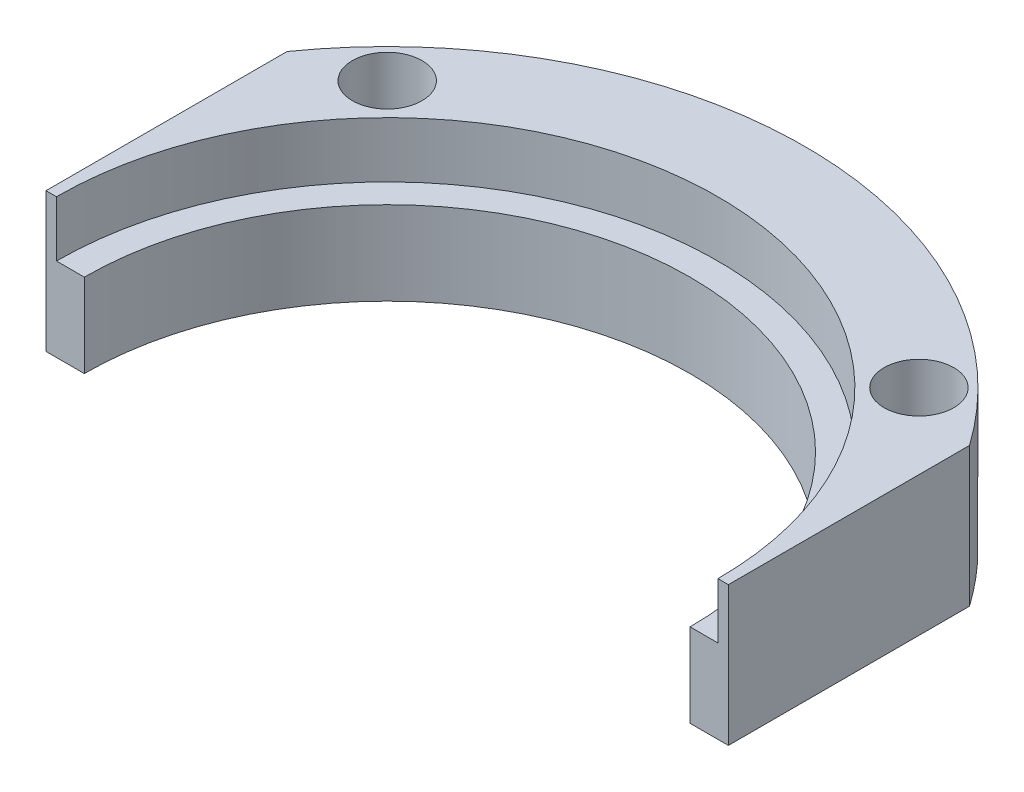
ISO-10303-21;
HEADER;
FILE_DESCRIPTION(('STEP AP214'),'2;1');
FILE_NAME('part.step','',(''),(''),'','','');
FILE_SCHEMA(('AUTOMOTIVE_DESIGN { 1 0 10303 214 1 1 1 1 }'));
ENDSEC;
DATA;
#1=APPLICATION_CONTEXT('core data for automotive mechanical design processes');
#2=APPLICATION_PROTOCOL_DEFINITION('international standard','automotive_design',2000,#1);
#3=PRODUCT_CONTEXT('',#1,'mechanical');
#4=PRODUCT('Part','Part','',(#3));
#5=PRODUCT_RELATED_PRODUCT_CATEGORY('part','',(#4));
#6=PRODUCT_DEFINITION_FORMATION('','',#4);
#7=PRODUCT_DEFINITION_CONTEXT('part definition',#1,'design');
#8=PRODUCT_DEFINITION('design','',#6,#7);
#9=PRODUCT_DEFINITION_SHAPE('','',#8);
#10=(LENGTH_UNIT() NAMED_UNIT(*) SI_UNIT(.MILLI.,.METRE.));
#11=(NAMED_UNIT(*) PLANE_ANGLE_UNIT() SI_UNIT($,.RADIAN.));
#12=(NAMED_UNIT(*) SI_UNIT($,.STERADIAN.) SOLID_ANGLE_UNIT());
#13=UNCERTAINTY_MEASURE_WITH_UNIT(LENGTH_MEASURE(1.E-05),#10,'distance_accuracy_value','');
#14=(GEOMETRIC_REPRESENTATION_CONTEXT(3) GLOBAL_UNCERTAINTY_ASSIGNED_CONTEXT((#13)) GLOBAL_UNIT_ASSIGNED_CONTEXT((#10,
#11,#12)) REPRESENTATION_CONTEXT('',''));
#15=CARTESIAN_POINT('',(0.,0.,0.));
#16=DIRECTION('',(0.,0.,1.));
#17=DIRECTION('',(1.,0.,0.));
#18=AXIS2_PLACEMENT_3D('',#15,#16,#17);
#19=CARTESIAN_POINT('',(0.,20.,0.));
#20=DIRECTION('',(0.,-1.,0.));
#21=DIRECTION('',(0.,0.,-1.));
#22=AXIS2_PLACEMENT_3D('',#19,#20,#21);
#23=CYLINDRICAL_SURFACE('',#22,43.5);
#24=CARTESIAN_POINT('',(0.,12.,0.));
#25=DIRECTION('',(0.,1.,0.));
#26=DIRECTION('',(0.,0.,1.));
#27=AXIS2_PLACEMENT_3D('',#24,#25,#26);
#28=CIRCLE('',#27,43.5);
#29=CARTESIAN_POINT('',(-43.5,12.,0.));
#30=VERTEX_POINT('',#29);
#31=CARTESIAN_POINT('',(43.5,12.,0.));
#32=VERTEX_POINT('',#31);
#33=EDGE_CURVE('E11',#30,#32,#28,.F.);
#34=ORIENTED_EDGE('',*,*,#33,.F.);
#35=DIRECTION('',(0.,-1.,0.));
#36=VECTOR('',#35,1.);
#37=CARTESIAN_POINT('',(-43.5,20.,0.));
#38=LINE('',#37,#36);
#39=CARTESIAN_POINT('',(-43.5,0.,0.));
#40=VERTEX_POINT('',#39);
#41=EDGE_CURVE('E169',#40,#30,#38,.F.);
#42=ORIENTED_EDGE('',*,*,#41,.F.);
#43=CARTESIAN_POINT('',(0.,0.,0.));
#44=DIRECTION('',(0.,1.,0.));
#45=DIRECTION('',(0.,0.,1.));
#46=AXIS2_PLACEMENT_3D('',#43,#44,#45);
#47=CIRCLE('',#46,43.5);
#48=CARTESIAN_POINT('',(43.5,0.,0.));
#49=VERTEX_POINT('',#48);
#50=EDGE_CURVE('E42',#49,#40,#47,.T.);
#51=ORIENTED_EDGE('',*,*,#50,.F.);
#52=DIRECTION('',(0.,-1.,0.));
#53=VECTOR('',#52,1.);
#54=CARTESIAN_POINT('',(43.5,20.,0.));
#55=LINE('',#54,#53);
#56=EDGE_CURVE('E172',#32,#49,#55,.T.);
#57=ORIENTED_EDGE('',*,*,#56,.F.);
#58=EDGE_LOOP('',(#34,#42,#51,#57));
#59=FACE_BOUND('',#58,.T.);
#60=ADVANCED_FACE('F33',(#59),#23,.F.);
#61=CARTESIAN_POINT('',(0.,20.,0.));
#62=DIRECTION('',(0.,0.,-1.));
#63=DIRECTION('',(-1.,0.,0.));
#64=AXIS2_PLACEMENT_3D('',#61,#62,#63);
#65=PLANE('',#64);
#66=DIRECTION('',(1.,0.,0.));
#67=VECTOR('',#66,1.);
#68=CARTESIAN_POINT('',(0.,20.,0.));
#69=LINE('',#68,#67);
#70=CARTESIAN_POINT('',(47.5,20.,0.));
#71=VERTEX_POINT('',#70);
#72=CARTESIAN_POINT('',(49.,20.,0.));
#73=VERTEX_POINT('',#72);
#74=EDGE_CURVE('E184',#71,#73,#69,.T.);
#75=ORIENTED_EDGE('',*,*,#74,.F.);
#76=DIRECTION('',(0.,1.,0.));
#77=VECTOR('',#76,1.);
#78=CARTESIAN_POINT('',(47.5,12.,0.));
#79=LINE('',#78,#77);
#80=CARTESIAN_POINT('',(47.5,12.,0.));
#81=VERTEX_POINT('',#80);
#82=EDGE_CURVE('E166',#71,#81,#79,.F.);
#83=ORIENTED_EDGE('',*,*,#82,.T.);
#84=DIRECTION('',(1.,0.,0.));
#85=VECTOR('',#84,1.);
#86=CARTESIAN_POINT('',(0.,12.,0.));
#87=LINE('',#86,#85);
#88=EDGE_CURVE('E161',#32,#81,#87,.T.);
#89=ORIENTED_EDGE('',*,*,#88,.F.);
#90=ORIENTED_EDGE('',*,*,#56,.T.);
#91=DIRECTION('',(1.,0.,0.));
#92=VECTOR('',#91,1.);
#93=CARTESIAN_POINT('',(0.,0.,0.));
#94=LINE('',#93,#92);
#95=CARTESIAN_POINT('',(49.,0.,0.));
#96=VERTEX_POINT('',#95);
#97=EDGE_CURVE('E198',#49,#96,#94,.T.);
#98=ORIENTED_EDGE('',*,*,#97,.T.);
#99=DIRECTION('',(0.,-1.,0.));
#100=VECTOR('',#99,1.);
#101=CARTESIAN_POINT('',(49.,20.,0.));
#102=LINE('',#101,#100);
#103=EDGE_CURVE('E188',#73,#96,#102,.T.);
#104=ORIENTED_EDGE('',*,*,#103,.F.);
#105=EDGE_LOOP('',(#75,#83,#89,#90,#98,#104));
#106=FACE_BOUND('',#105,.T.);
#107=ADVANCED_FACE('F262',(#106),#65,.F.);
#108=CARTESIAN_POINT('',(49.,20.,0.));
#109=DIRECTION('',(-1.,0.,0.));
#110=DIRECTION('',(0.,0.,1.));
#111=AXIS2_PLACEMENT_3D('',#108,#109,#110);
#112=PLANE('',#111);
#113=DIRECTION('',(0.,0.,-1.));
#114=VECTOR('',#113,1.);
#115=CARTESIAN_POINT('',(49.,0.,0.));
#116=LINE('',#115,#114);
#117=CARTESIAN_POINT('',(49.,0.,-34.6265793863616));
#118=VERTEX_POINT('',#117);
#119=EDGE_CURVE('E174',#96,#118,#116,.T.);
#120=ORIENTED_EDGE('',*,*,#119,.T.);
#121=DIRECTION('',(0.,-1.,0.));
#122=VECTOR('',#121,1.);
#123=CARTESIAN_POINT('',(49.,20.,-34.6265793863616));
#124=LINE('',#123,#122);
#125=CARTESIAN_POINT('',(49.,20.,-34.6265793863616));
#126=VERTEX_POINT('',#125);
#127=EDGE_CURVE('E208',#126,#118,#124,.T.);
#128=ORIENTED_EDGE('',*,*,#127,.F.);
#129=DIRECTION('',(0.,0.,-1.));
#130=VECTOR('',#129,1.);
#131=CARTESIAN_POINT('',(49.,20.,0.));
#132=LINE('',#131,#130);
#133=EDGE_CURVE('E175',#73,#126,#132,.T.);
#134=ORIENTED_EDGE('',*,*,#133,.F.);
#135=ORIENTED_EDGE('',*,*,#103,.T.);
#136=EDGE_LOOP('',(#120,#128,#134,#135));
#137=FACE_BOUND('',#136,.T.);
#138=ADVANCED_FACE('F35',(#137),#112,.F.);
#139=CARTESIAN_POINT('',(0.,20.,0.));
#140=DIRECTION('',(0.,-1.,0.));
#141=DIRECTION('',(0.,0.,-1.));
#142=AXIS2_PLACEMENT_3D('',#139,#140,#141);
#143=CYLINDRICAL_SURFACE('',#142,60.);
#144=CARTESIAN_POINT('',(0.,0.,0.));
#145=DIRECTION('',(0.,1.,0.));
#146=DIRECTION('',(0.,0.,1.));
#147=AXIS2_PLACEMENT_3D('',#144,#145,#146);
#148=CIRCLE('',#147,60.);
#149=CARTESIAN_POINT('',(40.5225457255929,0.,-44.2484269541554));
#150=VERTEX_POINT('',#149);
#151=CARTESIAN_POINT('',(-40.5225457255929,0.,-44.2484269541554));
#152=VERTEX_POINT('',#151);
#153=EDGE_CURVE('E139',#150,#152,#148,.T.);
#154=ORIENTED_EDGE('',*,*,#153,.T.);
#155=DIRECTION('',(0.,-1.,0.));
#156=VECTOR('',#155,1.);
#157=CARTESIAN_POINT('',(-40.5225457255929,10.,-44.2484269541554));
#158=LINE('',#157,#156);
#159=CARTESIAN_POINT('',(-40.5225457255929,10.,-44.2484269541554));
#160=VERTEX_POINT('',#159);
#161=EDGE_CURVE('E50',#160,#152,#158,.T.);
#162=ORIENTED_EDGE('',*,*,#161,.F.);
#163=CARTESIAN_POINT('',(0.,10.,0.));
#164=DIRECTION('',(0.,-1.,0.));
#165=DIRECTION('',(0.,0.,-1.));
#166=AXIS2_PLACEMENT_3D('',#163,#164,#165);
#167=CIRCLE('',#166,60.);
#168=CARTESIAN_POINT('',(-44.2484269541554,10.,-40.5225457255929));
#169=VERTEX_POINT('',#168);
#170=EDGE_CURVE('E125',#169,#160,#167,.T.);
#171=ORIENTED_EDGE('',*,*,#170,.F.);
#172=DIRECTION('',(0.,-1.,0.));
#173=VECTOR('',#172,1.);
#174=CARTESIAN_POINT('',(-44.2484269541554,10.,-40.5225457255929));
#175=LINE('',#174,#173);
#176=CARTESIAN_POINT('',(-44.2484269541554,0.,-40.5225457255929));
#177=VERTEX_POINT('',#176);
#178=EDGE_CURVE('E133',#169,#177,#175,.T.);
#179=ORIENTED_EDGE('',*,*,#178,.T.);
#180=CARTESIAN_POINT('',(-49.,0.,-34.6265793863616));
#181=VERTEX_POINT('',#180);
#182=EDGE_CURVE('E191',#177,#181,#148,.T.);
#183=ORIENTED_EDGE('',*,*,#182,.T.);
#184=DIRECTION('',(0.,-1.,0.));
#185=VECTOR('',#184,1.);
#186=CARTESIAN_POINT('',(-49.,20.,-34.6265793863616));
#187=LINE('',#186,#185);
#188=CARTESIAN_POINT('',(-49.,20.,-34.6265793863616));
#189=VERTEX_POINT('',#188);
#190=EDGE_CURVE('E205',#189,#181,#187,.T.);
#191=ORIENTED_EDGE('',*,*,#190,.F.);
#192=CARTESIAN_POINT('',(0.,20.,0.));
#193=DIRECTION('',(0.,1.,0.));
#194=DIRECTION('',(0.,0.,1.));
#195=AXIS2_PLACEMENT_3D('',#192,#193,#194);
#196=CIRCLE('',#195,60.);
#197=EDGE_CURVE('E178',#126,#189,#196,.T.);
#198=ORIENTED_EDGE('',*,*,#197,.F.);
#199=ORIENTED_EDGE('',*,*,#127,.T.);
#200=CARTESIAN_POINT('',(44.2484269541554,0.,-40.5225457255929));
#201=VERTEX_POINT('',#200);
#202=EDGE_CURVE('E192',#118,#201,#148,.T.);
#203=ORIENTED_EDGE('',*,*,#202,.T.);
#204=DIRECTION('',(0.,-1.,0.));
#205=VECTOR('',#204,1.);
#206=CARTESIAN_POINT('',(44.2484269541554,10.,-40.5225457255929));
#207=LINE('',#206,#205);
#208=CARTESIAN_POINT('',(44.2484269541554,10.,-40.5225457255929));
#209=VERTEX_POINT('',#208);
#210=EDGE_CURVE('E58',#209,#201,#207,.T.);
#211=ORIENTED_EDGE('',*,*,#210,.F.);
#212=CARTESIAN_POINT('',(0.,10.,0.));
#213=DIRECTION('',(0.,-1.,0.));
#214=DIRECTION('',(0.,0.,-1.));
#215=AXIS2_PLACEMENT_3D('',#212,#213,#214);
#216=CIRCLE('',#215,60.);
#217=CARTESIAN_POINT('',(40.5225457255929,10.,-44.2484269541554));
#218=VERTEX_POINT('',#217);
#219=EDGE_CURVE('E145',#218,#209,#216,.T.);
#220=ORIENTED_EDGE('',*,*,#219,.F.);
#221=DIRECTION('',(0.,-1.,0.));
#222=VECTOR('',#221,1.);
#223=CARTESIAN_POINT('',(40.5225457255929,10.,-44.2484269541554));
#224=LINE('',#223,#222);
#225=EDGE_CURVE('E151',#218,#150,#224,.T.);
#226=ORIENTED_EDGE('',*,*,#225,.T.);
#227=EDGE_LOOP('',(#154,#162,#171,#179,#183,#191,#198,#199,#203,#211,#220,#226));
#228=FACE_BOUND('',#227,.T.);
#229=ADVANCED_FACE('F136',(#228),#143,.T.);
#230=CARTESIAN_POINT('',(-49.,20.,0.));
#231=DIRECTION('',(-1.,0.,0.));
#232=DIRECTION('',(0.,0.,1.));
#233=AXIS2_PLACEMENT_3D('',#230,#231,#232);
#234=PLANE('',#233);
#235=DIRECTION('',(0.,0.,-1.));
#236=VECTOR('',#235,1.);
#237=CARTESIAN_POINT('',(-49.,0.,0.));
#238=LINE('',#237,#236);
#239=CARTESIAN_POINT('',(-49.,0.,0.));
#240=VERTEX_POINT('',#239);
#241=EDGE_CURVE('E195',#240,#181,#238,.T.);
#242=ORIENTED_EDGE('',*,*,#241,.F.);
#243=DIRECTION('',(0.,-1.,0.));
#244=VECTOR('',#243,1.);
#245=CARTESIAN_POINT('',(-49.,20.,0.));
#246=LINE('',#245,#244);
#247=CARTESIAN_POINT('',(-49.,20.,0.));
#248=VERTEX_POINT('',#247);
#249=EDGE_CURVE('E203',#248,#240,#246,.T.);
#250=ORIENTED_EDGE('',*,*,#249,.F.);
#251=DIRECTION('',(0.,0.,-1.));
#252=VECTOR('',#251,1.);
#253=CARTESIAN_POINT('',(-49.,20.,0.));
#254=LINE('',#253,#252);
#255=EDGE_CURVE('E181',#248,#189,#254,.T.);
#256=ORIENTED_EDGE('',*,*,#255,.T.);
#257=ORIENTED_EDGE('',*,*,#190,.T.);
#258=EDGE_LOOP('',(#242,#250,#256,#257));
#259=FACE_BOUND('',#258,.T.);
#260=ADVANCED_FACE('F232',(#259),#234,.T.);
#261=DIRECTION('',(1.,0.,0.));
#262=VECTOR('',#261,1.);
#263=CARTESIAN_POINT('',(0.,12.,0.));
#264=LINE('',#263,#262);
#265=CARTESIAN_POINT('',(-47.5,12.,0.));
#266=VERTEX_POINT('',#265);
#267=EDGE_CURVE('E158',#266,#30,#264,.T.);
#268=ORIENTED_EDGE('',*,*,#267,.F.);
#269=DIRECTION('',(0.,1.,0.));
#270=VECTOR('',#269,1.);
#271=CARTESIAN_POINT('',(-47.5,12.,0.));
#272=LINE('',#271,#270);
#273=CARTESIAN_POINT('',(-47.5,20.,0.));
#274=VERTEX_POINT('',#273);
#275=EDGE_CURVE('E163',#266,#274,#272,.T.);
#276=ORIENTED_EDGE('',*,*,#275,.T.);
#277=EDGE_CURVE('E185',#248,#274,#69,.T.);
#278=ORIENTED_EDGE('',*,*,#277,.F.);
#279=ORIENTED_EDGE('',*,*,#249,.T.);
#280=EDGE_CURVE('E179',#240,#40,#94,.T.);
#281=ORIENTED_EDGE('',*,*,#280,.T.);
#282=ORIENTED_EDGE('',*,*,#41,.T.);
#283=EDGE_LOOP('',(#268,#276,#278,#279,#281,#282));
#284=FACE_BOUND('',#283,.T.);
#285=ADVANCED_FACE('F270',(#284),#65,.F.);
#286=CARTESIAN_POINT('',(0.,20.,0.));
#287=DIRECTION('',(0.,1.,0.));
#288=DIRECTION('',(0.,0.,1.));
#289=AXIS2_PLACEMENT_3D('',#286,#287,#288);
#290=PLANE('',#289);
#291=CARTESIAN_POINT('',(-38.1837661840736,20.,-38.1837661840736));
#292=DIRECTION('',(0.,-1.,0.));
#293=DIRECTION('',(0.,0.,-1.));
#294=AXIS2_PLACEMENT_3D('',#291,#292,#293);
#295=CIRCLE('',#294,5.);
#296=CARTESIAN_POINT('',(-38.1837661840736,20.,-43.1837661840736));
#297=VERTEX_POINT('',#296);
#298=EDGE_CURVE('E219',#297,#297,#295,.T.);
#299=ORIENTED_EDGE('',*,*,#298,.T.);
#300=EDGE_LOOP('',(#299));
#301=FACE_BOUND('',#300,.T.);
#302=CARTESIAN_POINT('',(38.1837661840736,20.,-38.1837661840736));
#303=DIRECTION('',(0.,-1.,0.));
#304=DIRECTION('',(0.,0.,-1.));
#305=AXIS2_PLACEMENT_3D('',#302,#303,#304);
#306=CIRCLE('',#305,5.);
#307=CARTESIAN_POINT('',(38.1837661840736,20.,-43.1837661840736));
#308=VERTEX_POINT('',#307);
#309=EDGE_CURVE('E214',#308,#308,#306,.T.);
#310=ORIENTED_EDGE('',*,*,#309,.T.);
#311=EDGE_LOOP('',(#310));
#312=FACE_BOUND('',#311,.T.);
#313=CARTESIAN_POINT('',(0.,20.,0.));
#314=DIRECTION('',(0.,1.,0.));
#315=DIRECTION('',(0.,0.,1.));
#316=AXIS2_PLACEMENT_3D('',#313,#314,#315);
#317=CIRCLE('',#316,47.5);
#318=EDGE_CURVE('E153',#71,#274,#317,.T.);
#319=ORIENTED_EDGE('',*,*,#318,.F.);
#320=ORIENTED_EDGE('',*,*,#74,.T.);
#321=ORIENTED_EDGE('',*,*,#133,.T.);
#322=ORIENTED_EDGE('',*,*,#197,.T.);
#323=ORIENTED_EDGE('',*,*,#255,.F.);
#324=ORIENTED_EDGE('',*,*,#277,.T.);
#325=EDGE_LOOP('',(#319,#320,#321,#322,#323,#324));
#326=FACE_BOUND('',#325,.T.);
#327=ADVANCED_FACE('F239',(#301,#312,#326),#290,.T.);
#328=CARTESIAN_POINT('',(0.,0.,0.));
#329=DIRECTION('',(0.,1.,0.));
#330=DIRECTION('',(0.,0.,1.));
#331=AXIS2_PLACEMENT_3D('',#328,#329,#330);
#332=PLANE('',#331);
#333=ORIENTED_EDGE('',*,*,#182,.F.);
#334=CARTESIAN_POINT('',(-38.1837661840736,0.,-38.1837661840736));
#335=DIRECTION('',(0.,-1.,0.));
#336=DIRECTION('',(0.,0.,-1.));
#337=AXIS2_PLACEMENT_3D('',#334,#335,#336);
#338=CIRCLE('',#337,6.5);
#339=EDGE_CURVE('E130',#152,#177,#338,.T.);
#340=ORIENTED_EDGE('',*,*,#339,.F.);
#341=ORIENTED_EDGE('',*,*,#153,.F.);
#342=CARTESIAN_POINT('',(38.1837661840736,0.,-38.1837661840736));
#343=DIRECTION('',(0.,-1.,0.));
#344=DIRECTION('',(0.,0.,-1.));
#345=AXIS2_PLACEMENT_3D('',#342,#343,#344);
#346=CIRCLE('',#345,6.5);
#347=EDGE_CURVE('E141',#201,#150,#346,.T.);
#348=ORIENTED_EDGE('',*,*,#347,.F.);
#349=ORIENTED_EDGE('',*,*,#202,.F.);
#350=ORIENTED_EDGE('',*,*,#119,.F.);
#351=ORIENTED_EDGE('',*,*,#97,.F.);
#352=ORIENTED_EDGE('',*,*,#50,.T.);
#353=ORIENTED_EDGE('',*,*,#280,.F.);
#354=ORIENTED_EDGE('',*,*,#241,.T.);
#355=EDGE_LOOP('',(#333,#340,#341,#348,#349,#350,#351,#352,#353,#354));
#356=FACE_BOUND('',#355,.T.);
#357=ADVANCED_FACE('F228',(#356),#332,.F.);
#358=CARTESIAN_POINT('',(0.,12.,0.));
#359=DIRECTION('',(0.,1.,0.));
#360=DIRECTION('',(0.,0.,1.));
#361=AXIS2_PLACEMENT_3D('',#358,#359,#360);
#362=CYLINDRICAL_SURFACE('',#361,47.5);
#363=ORIENTED_EDGE('',*,*,#318,.T.);
#364=ORIENTED_EDGE('',*,*,#275,.F.);
#365=CARTESIAN_POINT('',(0.,12.,0.));
#366=DIRECTION('',(0.,1.,0.));
#367=DIRECTION('',(0.,0.,1.));
#368=AXIS2_PLACEMENT_3D('',#365,#366,#367);
#369=CIRCLE('',#368,47.5);
#370=EDGE_CURVE('E155',#81,#266,#369,.T.);
#371=ORIENTED_EDGE('',*,*,#370,.F.);
#372=ORIENTED_EDGE('',*,*,#82,.F.);
#373=EDGE_LOOP('',(#363,#364,#371,#372));
#374=FACE_BOUND('',#373,.T.);
#375=ADVANCED_FACE('F258',(#374),#362,.F.);
#376=CARTESIAN_POINT('',(0.,12.,0.));
#377=DIRECTION('',(0.,1.,0.));
#378=DIRECTION('',(0.,0.,1.));
#379=AXIS2_PLACEMENT_3D('',#376,#377,#378);
#380=PLANE('',#379);
#381=ORIENTED_EDGE('',*,*,#88,.T.);
#382=ORIENTED_EDGE('',*,*,#370,.T.);
#383=ORIENTED_EDGE('',*,*,#267,.T.);
#384=ORIENTED_EDGE('',*,*,#33,.T.);
#385=EDGE_LOOP('',(#381,#382,#383,#384));
#386=FACE_BOUND('',#385,.T.);
#387=ADVANCED_FACE('F250',(#386),#380,.T.);
#388=CARTESIAN_POINT('',(38.1837661840736,10.,-38.1837661840736));
#389=DIRECTION('',(0.,-1.,0.));
#390=DIRECTION('',(0.,0.,-1.));
#391=AXIS2_PLACEMENT_3D('',#388,#389,#390);
#392=CYLINDRICAL_SURFACE('',#391,6.5);
#393=ORIENTED_EDGE('',*,*,#347,.T.);
#394=ORIENTED_EDGE('',*,*,#225,.F.);
#395=CARTESIAN_POINT('',(38.1837661840736,10.,-38.1837661840736));
#396=DIRECTION('',(0.,-1.,0.));
#397=DIRECTION('',(0.,0.,-1.));
#398=AXIS2_PLACEMENT_3D('',#395,#396,#397);
#399=CIRCLE('',#398,6.5);
#400=EDGE_CURVE('E147',#209,#218,#399,.T.);
#401=ORIENTED_EDGE('',*,*,#400,.F.);
#402=ORIENTED_EDGE('',*,*,#210,.T.);
#403=EDGE_LOOP('',(#393,#394,#401,#402));
#404=FACE_BOUND('',#403,.T.);
#405=ADVANCED_FACE('F248',(#404),#392,.F.);
#406=CARTESIAN_POINT('',(0.,10.,0.));
#407=DIRECTION('',(0.,-1.,0.));
#408=DIRECTION('',(0.,0.,-1.));
#409=AXIS2_PLACEMENT_3D('',#406,#407,#408);
#410=PLANE('',#409);
#411=CARTESIAN_POINT('',(38.1837661840736,10.,-38.1837661840736));
#412=DIRECTION('',(0.,-1.,0.));
#413=DIRECTION('',(0.,0.,-1.));
#414=AXIS2_PLACEMENT_3D('',#411,#412,#413);
#415=CIRCLE('',#414,5.);
#416=CARTESIAN_POINT('',(38.1837661840736,10.,-43.1837661840736));
#417=VERTEX_POINT('',#416);
#418=EDGE_CURVE('E37',#417,#417,#415,.T.);
#419=ORIENTED_EDGE('',*,*,#418,.F.);
#420=EDGE_LOOP('',(#419));
#421=FACE_BOUND('',#420,.T.);
#422=ORIENTED_EDGE('',*,*,#219,.T.);
#423=ORIENTED_EDGE('',*,*,#400,.T.);
#424=EDGE_LOOP('',(#422,#423));
#425=FACE_BOUND('',#424,.T.);
#426=ADVANCED_FACE('F247',(#421,#425),#410,.T.);
#427=CARTESIAN_POINT('',(-38.1837661840736,10.,-38.1837661840736));
#428=DIRECTION('',(0.,-1.,0.));
#429=DIRECTION('',(0.,0.,-1.));
#430=AXIS2_PLACEMENT_3D('',#427,#428,#429);
#431=CYLINDRICAL_SURFACE('',#430,6.5);
#432=ORIENTED_EDGE('',*,*,#339,.T.);
#433=ORIENTED_EDGE('',*,*,#178,.F.);
#434=CARTESIAN_POINT('',(-38.1837661840736,10.,-38.1837661840736));
#435=DIRECTION('',(0.,-1.,0.));
#436=DIRECTION('',(0.,0.,-1.));
#437=AXIS2_PLACEMENT_3D('',#434,#435,#436);
#438=CIRCLE('',#437,6.5);
#439=EDGE_CURVE('E127',#160,#169,#438,.T.);
#440=ORIENTED_EDGE('',*,*,#439,.F.);
#441=ORIENTED_EDGE('',*,*,#161,.T.);
#442=EDGE_LOOP('',(#432,#433,#440,#441));
#443=FACE_BOUND('',#442,.T.);
#444=ADVANCED_FACE('F132',(#443),#431,.F.);
#445=CARTESIAN_POINT('',(0.,10.,0.));
#446=DIRECTION('',(0.,-1.,0.));
#447=DIRECTION('',(0.,0.,-1.));
#448=AXIS2_PLACEMENT_3D('',#445,#446,#447);
#449=PLANE('',#448);
#450=CARTESIAN_POINT('',(-38.1837661840736,10.,-38.1837661840736));
#451=DIRECTION('',(0.,-1.,0.));
#452=DIRECTION('',(0.,0.,-1.));
#453=AXIS2_PLACEMENT_3D('',#450,#451,#452);
#454=CIRCLE('',#453,5.);
#455=CARTESIAN_POINT('',(-38.1837661840736,10.,-43.1837661840736));
#456=VERTEX_POINT('',#455);
#457=EDGE_CURVE('E212',#456,#456,#454,.T.);
#458=ORIENTED_EDGE('',*,*,#457,.F.);
#459=EDGE_LOOP('',(#458));
#460=FACE_BOUND('',#459,.T.);
#461=ORIENTED_EDGE('',*,*,#170,.T.);
#462=ORIENTED_EDGE('',*,*,#439,.T.);
#463=EDGE_LOOP('',(#461,#462));
#464=FACE_BOUND('',#463,.T.);
#465=ADVANCED_FACE('F126',(#460,#464),#449,.T.);
#466=CARTESIAN_POINT('',(-38.1837661840736,20.,-38.1837661840736));
#467=DIRECTION('',(0.,-1.,0.));
#468=DIRECTION('',(0.,0.,-1.));
#469=AXIS2_PLACEMENT_3D('',#466,#467,#468);
#470=CYLINDRICAL_SURFACE('',#469,5.);
#471=ORIENTED_EDGE('',*,*,#457,.T.);
#472=EDGE_LOOP('',(#471));
#473=FACE_BOUND('',#472,.T.);
#474=ORIENTED_EDGE('',*,*,#298,.F.);
#475=EDGE_LOOP('',(#474));
#476=FACE_BOUND('',#475,.T.);
#477=ADVANCED_FACE('F359',(#473,#476),#470,.F.);
#478=CARTESIAN_POINT('',(38.1837661840736,20.,-38.1837661840736));
#479=DIRECTION('',(0.,-1.,0.));
#480=DIRECTION('',(0.,0.,-1.));
#481=AXIS2_PLACEMENT_3D('',#478,#479,#480);
#482=CYLINDRICAL_SURFACE('',#481,5.);
#483=ORIENTED_EDGE('',*,*,#418,.T.);
#484=EDGE_LOOP('',(#483));
#485=FACE_BOUND('',#484,.T.);
#486=ORIENTED_EDGE('',*,*,#309,.F.);
#487=EDGE_LOOP('',(#486));
#488=FACE_BOUND('',#487,.T.);
#489=ADVANCED_FACE('F369',(#485,#488),#482,.F.);
#490=CLOSED_SHELL('',(#60,#107,#138,#229,#260,#285,#327,#357,#375,#387,#405,#426,#444,#465,#477,#489));
#491=MANIFOLD_SOLID_BREP('B2',#490);
#492=ADVANCED_BREP_SHAPE_REPRESENTATION('',(#18,#491),#14);
#493=SHAPE_DEFINITION_REPRESENTATION(#9,#492);
ENDSEC;
END-ISO-10303-21;
